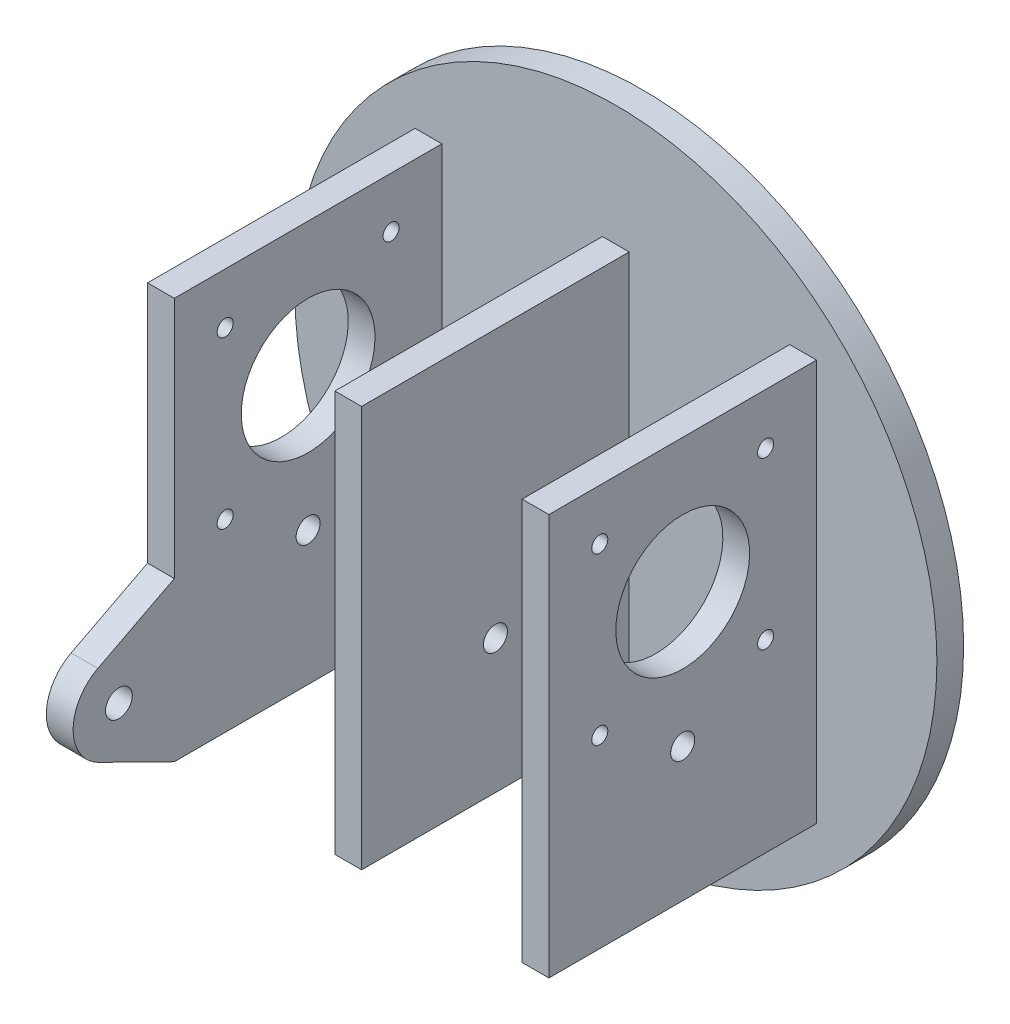
ISO-10303-21;
HEADER;
FILE_DESCRIPTION(('STEP AP214'),'2;1');
FILE_NAME('part.step','',(''),(''),'','','');
FILE_SCHEMA(('AUTOMOTIVE_DESIGN { 1 0 10303 214 1 1 1 1 }'));
ENDSEC;
DATA;
#1=APPLICATION_CONTEXT('core data for automotive mechanical design processes');
#2=APPLICATION_PROTOCOL_DEFINITION('international standard','automotive_design',2000,#1);
#3=PRODUCT_CONTEXT('',#1,'mechanical');
#4=PRODUCT('Part','Part','',(#3));
#5=PRODUCT_RELATED_PRODUCT_CATEGORY('part','',(#4));
#6=PRODUCT_DEFINITION_FORMATION('','',#4);
#7=PRODUCT_DEFINITION_CONTEXT('part definition',#1,'design');
#8=PRODUCT_DEFINITION('design','',#6,#7);
#9=PRODUCT_DEFINITION_SHAPE('','',#8);
#10=(LENGTH_UNIT() NAMED_UNIT(*) SI_UNIT(.MILLI.,.METRE.));
#11=(NAMED_UNIT(*) PLANE_ANGLE_UNIT() SI_UNIT($,.RADIAN.));
#12=(NAMED_UNIT(*) SI_UNIT($,.STERADIAN.) SOLID_ANGLE_UNIT());
#13=UNCERTAINTY_MEASURE_WITH_UNIT(LENGTH_MEASURE(1.E-05),#10,'distance_accuracy_value','');
#14=(GEOMETRIC_REPRESENTATION_CONTEXT(3) GLOBAL_UNCERTAINTY_ASSIGNED_CONTEXT((#13)) GLOBAL_UNIT_ASSIGNED_CONTEXT((#10,
#11,#12)) REPRESENTATION_CONTEXT('',''));
#15=CARTESIAN_POINT('',(0.,0.,0.));
#16=DIRECTION('',(0.,0.,1.));
#17=DIRECTION('',(1.,0.,0.));
#18=AXIS2_PLACEMENT_3D('',#15,#16,#17);
#19=CARTESIAN_POINT('',(0.,-9.96355775662041E-12,55.0000000015785));
#20=DIRECTION('',(0.,5.51836354389934E-13,-1.));
#21=DIRECTION('',(1.,0.,0.));
#22=AXIS2_PLACEMENT_3D('',#19,#20,#21);
#23=PLANE('',#22);
#24=DIRECTION('',(-1.,0.,0.));
#25=VECTOR('',#24,1.);
#26=CARTESIAN_POINT('',(-32.5,-7.85533905933753,55.0000000015741));
#27=LINE('',#26,#25);
#28=CARTESIAN_POINT('',(-32.5,-7.85533905933753,55.0000000015741));
#29=VERTEX_POINT('',#28);
#30=CARTESIAN_POINT('',(-37.5,-7.85533905933753,55.0000000015741));
#31=VERTEX_POINT('',#30);
#32=EDGE_CURVE('E59',#29,#31,#27,.T.);
#33=ORIENTED_EDGE('',*,*,#32,.F.);
#34=DIRECTION('',(0.,1.,5.51836354389934E-13));
#35=VECTOR('',#34,1.);
#36=CARTESIAN_POINT('',(-32.5,-37.5000000000099,55.0000000015578));
#37=LINE('',#36,#35);
#38=CARTESIAN_POINT('',(-32.5,37.4999999999901,55.0000000015992));
#39=VERTEX_POINT('',#38);
#40=EDGE_CURVE('E173',#29,#39,#37,.T.);
#41=ORIENTED_EDGE('',*,*,#40,.T.);
#42=DIRECTION('',(-1.,0.,0.));
#43=VECTOR('',#42,1.);
#44=CARTESIAN_POINT('',(-37.5,37.4999999999901,55.0000000015992));
#45=LINE('',#44,#43);
#46=CARTESIAN_POINT('',(-37.5,37.4999999999901,55.0000000015992));
#47=VERTEX_POINT('',#46);
#48=EDGE_CURVE('E380',#39,#47,#45,.T.);
#49=ORIENTED_EDGE('',*,*,#48,.T.);
#50=DIRECTION('',(0.,-1.,-5.51836354389934E-13));
#51=VECTOR('',#50,1.);
#52=CARTESIAN_POINT('',(-37.5,-37.5000000000099,55.0000000015578));
#53=LINE('',#52,#51);
#54=EDGE_CURVE('E370',#47,#31,#53,.T.);
#55=ORIENTED_EDGE('',*,*,#54,.T.);
#56=EDGE_LOOP('',(#33,#41,#49,#55));
#57=FACE_BOUND('',#56,.T.);
#58=ADVANCED_FACE('F41',(#57),#23,.F.);
#59=CARTESIAN_POINT('',(0.,1.76282599628763E-11,5.00000000157842));
#60=DIRECTION('',(0.,5.51836354389934E-13,-1.));
#61=DIRECTION('',(1.,0.,0.));
#62=AXIS2_PLACEMENT_3D('',#59,#60,#61);
#63=PLANE('',#62);
#64=DIRECTION('',(-1.,0.,0.));
#65=VECTOR('',#64,1.);
#66=CARTESIAN_POINT('',(37.5,37.5000000000176,5.00000000159911));
#67=LINE('',#66,#65);
#68=CARTESIAN_POINT('',(37.5,37.5000000000176,5.00000000159911));
#69=VERTEX_POINT('',#68);
#70=CARTESIAN_POINT('',(32.5,37.5000000000176,5.00000000159911));
#71=VERTEX_POINT('',#70);
#72=EDGE_CURVE('E324',#69,#71,#67,.T.);
#73=ORIENTED_EDGE('',*,*,#72,.F.);
#74=DIRECTION('',(0.,1.,5.51836354389934E-13));
#75=VECTOR('',#74,1.);
#76=CARTESIAN_POINT('',(37.5,-37.4999999999824,5.00000000155773));
#77=LINE('',#76,#75);
#78=CARTESIAN_POINT('',(37.5,-37.4999999999824,5.00000000155773));
#79=VERTEX_POINT('',#78);
#80=EDGE_CURVE('E330',#79,#69,#77,.T.);
#81=ORIENTED_EDGE('',*,*,#80,.F.);
#82=DIRECTION('',(1.,0.,0.));
#83=VECTOR('',#82,1.);
#84=CARTESIAN_POINT('',(37.5,-37.4999999999824,5.00000000155773));
#85=LINE('',#84,#83);
#86=CARTESIAN_POINT('',(32.5,-37.4999999999824,5.00000000155773));
#87=VERTEX_POINT('',#86);
#88=EDGE_CURVE('E347',#87,#79,#85,.T.);
#89=ORIENTED_EDGE('',*,*,#88,.F.);
#90=DIRECTION('',(0.,-1.,-5.51836354389934E-13));
#91=VECTOR('',#90,1.);
#92=CARTESIAN_POINT('',(32.5,-37.4999999999824,5.00000000155773));
#93=LINE('',#92,#91);
#94=EDGE_CURVE('E343',#71,#87,#93,.T.);
#95=ORIENTED_EDGE('',*,*,#94,.F.);
#96=EDGE_LOOP('',(#73,#81,#89,#95));
#97=FACE_BOUND('',#96,.T.);
#98=CARTESIAN_POINT('',(0.,1.76282599628763E-11,5.00000000157842));
#99=DIRECTION('',(0.,5.51836354389934E-13,-1.));
#100=DIRECTION('',(1.,0.,0.));
#101=AXIS2_PLACEMENT_3D('',#98,#99,#100);
#102=CIRCLE('',#101,60.);
#103=CARTESIAN_POINT('',(60.,1.76282599628763E-11,5.00000000157842));
#104=VERTEX_POINT('',#103);
#105=EDGE_CURVE('E51',#104,#104,#102,.T.);
#106=ORIENTED_EDGE('',*,*,#105,.F.);
#107=EDGE_LOOP('',(#106));
#108=FACE_BOUND('',#107,.T.);
#109=DIRECTION('',(0.,-1.,-5.51836354389934E-13));
#110=VECTOR('',#109,1.);
#111=CARTESIAN_POINT('',(-37.5,-37.4999999999823,5.00000000155773));
#112=LINE('',#111,#110);
#113=CARTESIAN_POINT('',(-37.5,37.5000000000177,5.00000000159911));
#114=VERTEX_POINT('',#113);
#115=CARTESIAN_POINT('',(-37.5,-37.4999999999823,5.00000000155773));
#116=VERTEX_POINT('',#115);
#117=EDGE_CURVE('E369',#114,#116,#112,.T.);
#118=ORIENTED_EDGE('',*,*,#117,.F.);
#119=DIRECTION('',(-1.,0.,0.));
#120=VECTOR('',#119,1.);
#121=CARTESIAN_POINT('',(-37.5,37.5000000000177,5.00000000159911));
#122=LINE('',#121,#120);
#123=CARTESIAN_POINT('',(-32.5,37.5000000000177,5.00000000159911));
#124=VERTEX_POINT('',#123);
#125=EDGE_CURVE('E374',#124,#114,#122,.T.);
#126=ORIENTED_EDGE('',*,*,#125,.F.);
#127=DIRECTION('',(0.,1.,5.51836354389934E-13));
#128=VECTOR('',#127,1.);
#129=CARTESIAN_POINT('',(-32.5,-37.4999999999823,5.00000000155773));
#130=LINE('',#129,#128);
#131=CARTESIAN_POINT('',(-32.5,-37.4999999999823,5.00000000155773));
#132=VERTEX_POINT('',#131);
#133=EDGE_CURVE('E391',#132,#124,#130,.T.);
#134=ORIENTED_EDGE('',*,*,#133,.F.);
#135=DIRECTION('',(1.,0.,0.));
#136=VECTOR('',#135,1.);
#137=CARTESIAN_POINT('',(-37.5,-37.4999999999823,5.00000000155773));
#138=LINE('',#137,#136);
#139=EDGE_CURVE('E387',#116,#132,#138,.T.);
#140=ORIENTED_EDGE('',*,*,#139,.F.);
#141=EDGE_LOOP('',(#118,#126,#134,#140));
#142=FACE_BOUND('',#141,.T.);
#143=DIRECTION('',(0.,-1.,-5.51836354389934E-13));
#144=VECTOR('',#143,1.);
#145=CARTESIAN_POINT('',(-2.50000000000001,37.5000000000176,5.00000000159911));
#146=LINE('',#145,#144);
#147=CARTESIAN_POINT('',(-2.50000000000001,37.5000000000176,5.00000000159911));
#148=VERTEX_POINT('',#147);
#149=CARTESIAN_POINT('',(-2.50000000000001,-37.4999999999824,5.00000000155773));
#150=VERTEX_POINT('',#149);
#151=EDGE_CURVE('E296',#148,#150,#146,.T.);
#152=ORIENTED_EDGE('',*,*,#151,.F.);
#153=DIRECTION('',(-1.,0.,0.));
#154=VECTOR('',#153,1.);
#155=CARTESIAN_POINT('',(2.49999999999999,37.5000000000176,5.00000000159911));
#156=LINE('',#155,#154);
#157=CARTESIAN_POINT('',(2.49999999999999,37.5000000000176,5.00000000159911));
#158=VERTEX_POINT('',#157);
#159=EDGE_CURVE('E286',#158,#148,#156,.T.);
#160=ORIENTED_EDGE('',*,*,#159,.F.);
#161=DIRECTION('',(0.,1.,5.51836354389934E-13));
#162=VECTOR('',#161,1.);
#163=CARTESIAN_POINT('',(2.49999999999999,37.5000000000176,5.00000000159911));
#164=LINE('',#163,#162);
#165=CARTESIAN_POINT('',(2.49999999999999,-37.4999999999824,5.00000000155773));
#166=VERTEX_POINT('',#165);
#167=EDGE_CURVE('E303',#166,#158,#164,.T.);
#168=ORIENTED_EDGE('',*,*,#167,.F.);
#169=DIRECTION('',(1.,0.,0.));
#170=VECTOR('',#169,1.);
#171=CARTESIAN_POINT('',(2.49999999999999,-37.4999999999824,5.00000000155773));
#172=LINE('',#171,#170);
#173=EDGE_CURVE('E67',#150,#166,#172,.T.);
#174=ORIENTED_EDGE('',*,*,#173,.F.);
#175=EDGE_LOOP('',(#152,#160,#168,#174));
#176=FACE_BOUND('',#175,.T.);
#177=ADVANCED_FACE('F463',(#97,#108,#142,#176),#63,.F.);
#178=CARTESIAN_POINT('',(0.,2.0387441734826E-11,1.57841795189739E-09));
#179=DIRECTION('',(0.,5.51836354389934E-13,-1.));
#180=DIRECTION('',(1.,0.,0.));
#181=AXIS2_PLACEMENT_3D('',#178,#179,#180);
#182=PLANE('',#181);
#183=CARTESIAN_POINT('',(0.,2.0387441734826E-11,1.57841795189739E-09));
#184=DIRECTION('',(0.,5.51836354389934E-13,-1.));
#185=DIRECTION('',(1.,0.,0.));
#186=AXIS2_PLACEMENT_3D('',#183,#184,#185);
#187=CIRCLE('',#186,60.);
#188=CARTESIAN_POINT('',(60.,2.0387441734826E-11,1.57841795189739E-09));
#189=VERTEX_POINT('',#188);
#190=EDGE_CURVE('E11',#189,#189,#187,.T.);
#191=ORIENTED_EDGE('',*,*,#190,.T.);
#192=EDGE_LOOP('',(#191));
#193=FACE_BOUND('',#192,.T.);
#194=CARTESIAN_POINT('',(0.,2.0387441734826E-11,1.57841795189739E-09));
#195=DIRECTION('',(0.,5.51836354389934E-13,-1.));
#196=DIRECTION('',(1.,0.,0.));
#197=AXIS2_PLACEMENT_3D('',#194,#195,#196);
#198=CIRCLE('',#197,1.5);
#199=CARTESIAN_POINT('',(1.5,2.0387441734826E-11,1.57841795189739E-09));
#200=VERTEX_POINT('',#199);
#201=EDGE_CURVE('E413',#200,#200,#198,.T.);
#202=ORIENTED_EDGE('',*,*,#201,.F.);
#203=EDGE_LOOP('',(#202));
#204=FACE_BOUND('',#203,.T.);
#205=ADVANCED_FACE('F468',(#193,#204),#182,.T.);
#206=CARTESIAN_POINT('',(0.,2.0387441734826E-11,1.57841795189739E-09));
#207=DIRECTION('',(0.,-5.51836354389934E-13,1.));
#208=DIRECTION('',(-1.,0.,0.));
#209=AXIS2_PLACEMENT_3D('',#206,#207,#208);
#210=CYLINDRICAL_SURFACE('',#209,60.);
#211=ORIENTED_EDGE('',*,*,#190,.F.);
#212=EDGE_LOOP('',(#211));
#213=FACE_BOUND('',#212,.T.);
#214=ORIENTED_EDGE('',*,*,#105,.T.);
#215=EDGE_LOOP('',(#214));
#216=FACE_BOUND('',#215,.T.);
#217=ADVANCED_FACE('F43',(#213,#216),#210,.T.);
#218=CARTESIAN_POINT('',(0.,2.0387441734826E-11,1.57841795189739E-09));
#219=DIRECTION('',(0.,-5.51836354389934E-13,1.));
#220=DIRECTION('',(-1.,0.,0.));
#221=AXIS2_PLACEMENT_3D('',#218,#219,#220);
#222=CYLINDRICAL_SURFACE('',#221,1.5);
#223=ORIENTED_EDGE('',*,*,#201,.T.);
#224=EDGE_LOOP('',(#223));
#225=FACE_BOUND('',#224,.T.);
#226=CARTESIAN_POINT('',(0.,1.76282599628763E-11,5.00000000157842));
#227=DIRECTION('',(0.,5.51836354389934E-13,-1.));
#228=DIRECTION('',(1.,0.,0.));
#229=AXIS2_PLACEMENT_3D('',#226,#227,#228);
#230=CIRCLE('',#229,1.5);
#231=CARTESIAN_POINT('',(1.5,1.76282599628763E-11,5.00000000157842));
#232=VERTEX_POINT('',#231);
#233=EDGE_CURVE('E412',#232,#232,#230,.T.);
#234=ORIENTED_EDGE('',*,*,#233,.F.);
#235=EDGE_LOOP('',(#234));
#236=FACE_BOUND('',#235,.T.);
#237=ADVANCED_FACE('F488',(#225,#236),#222,.F.);
#238=CARTESIAN_POINT('',(-37.5,-37.5000000000099,55.0000000015578));
#239=DIRECTION('',(1.,0.,0.));
#240=DIRECTION('',(0.,-1.,-5.51836354389934E-13));
#241=AXIS2_PLACEMENT_3D('',#238,#239,#240);
#242=PLANE('',#241);
#243=CARTESIAN_POINT('',(-37.5,-3.00000000000472,45.5000000015768));
#244=DIRECTION('',(-1.,0.,0.));
#245=DIRECTION('',(0.,1.,5.51836354389934E-13));
#246=AXIS2_PLACEMENT_3D('',#243,#244,#245);
#247=CIRCLE('',#246,1.5);
#248=CARTESIAN_POINT('',(-37.5,-1.50000000000473,45.5000000015776));
#249=VERTEX_POINT('',#248);
#250=EDGE_CURVE('E217',#249,#249,#247,.T.);
#251=ORIENTED_EDGE('',*,*,#250,.F.);
#252=EDGE_LOOP('',(#251));
#253=FACE_BOUND('',#252,.T.);
#254=CARTESIAN_POINT('',(-37.5,28.0000000000124,14.5000000015939));
#255=DIRECTION('',(-1.,0.,0.));
#256=DIRECTION('',(0.,1.,5.51836354389934E-13));
#257=AXIS2_PLACEMENT_3D('',#254,#255,#256);
#258=CIRCLE('',#257,1.50000000000009);
#259=CARTESIAN_POINT('',(-37.5,29.5000000000125,14.5000000015947));
#260=VERTEX_POINT('',#259);
#261=EDGE_CURVE('E210',#260,#260,#258,.T.);
#262=ORIENTED_EDGE('',*,*,#261,.F.);
#263=EDGE_LOOP('',(#262));
#264=FACE_BOUND('',#263,.T.);
#265=CARTESIAN_POINT('',(-37.5,27.9999999999953,45.5000000015939));
#266=DIRECTION('',(-1.,0.,0.));
#267=DIRECTION('',(0.,1.,5.51836354389934E-13));
#268=AXIS2_PLACEMENT_3D('',#265,#266,#267);
#269=CIRCLE('',#268,1.50000000000008);
#270=CARTESIAN_POINT('',(-37.5,29.4999999999954,45.5000000015947));
#271=VERTEX_POINT('',#270);
#272=EDGE_CURVE('E201',#271,#271,#269,.T.);
#273=ORIENTED_EDGE('',*,*,#272,.F.);
#274=EDGE_LOOP('',(#273));
#275=FACE_BOUND('',#274,.T.);
#276=CARTESIAN_POINT('',(-37.5,12.5000000000038,30.0000000015853));
#277=DIRECTION('',(-1.,0.,0.));
#278=DIRECTION('',(0.,1.,5.51836354389934E-13));
#279=AXIS2_PLACEMENT_3D('',#276,#277,#278);
#280=CIRCLE('',#279,12.5);
#281=CARTESIAN_POINT('',(-37.5,25.0000000000038,30.0000000015922));
#282=VERTEX_POINT('',#281);
#283=EDGE_CURVE('E198',#282,#282,#280,.T.);
#284=ORIENTED_EDGE('',*,*,#283,.F.);
#285=EDGE_LOOP('',(#284));
#286=FACE_BOUND('',#285,.T.);
#287=CARTESIAN_POINT('',(-37.5,-2.99999999998762,14.5000000015768));
#288=DIRECTION('',(-1.,0.,0.));
#289=DIRECTION('',(0.,1.,5.51836354389934E-13));
#290=AXIS2_PLACEMENT_3D('',#287,#288,#289);
#291=CIRCLE('',#290,1.5);
#292=CARTESIAN_POINT('',(-37.5,-1.49999999998762,14.5000000015776));
#293=VERTEX_POINT('',#292);
#294=EDGE_CURVE('E226',#293,#293,#291,.T.);
#295=ORIENTED_EDGE('',*,*,#294,.F.);
#296=EDGE_LOOP('',(#295));
#297=FACE_BOUND('',#296,.T.);
#298=CARTESIAN_POINT('',(-37.5,-12.4999999999962,30.0000000015715));
#299=DIRECTION('',(1.,0.,0.));
#300=DIRECTION('',(0.,-1.,-5.51836354389934E-13));
#301=AXIS2_PLACEMENT_3D('',#298,#299,#300);
#302=CIRCLE('',#301,2.24506403026729);
#303=CARTESIAN_POINT('',(-37.5,-14.7450640302635,30.0000000015703));
#304=VERTEX_POINT('',#303);
#305=EDGE_CURVE('E256',#304,#304,#302,.F.);
#306=ORIENTED_EDGE('',*,*,#305,.F.);
#307=EDGE_LOOP('',(#306));
#308=FACE_BOUND('',#307,.T.);
#309=ORIENTED_EDGE('',*,*,#117,.T.);
#310=DIRECTION('',(0.,5.51836354389934E-13,-1.));
#311=VECTOR('',#310,1.);
#312=CARTESIAN_POINT('',(-37.5,-37.5000000000099,55.0000000015578));
#313=LINE('',#312,#311);
#314=CARTESIAN_POINT('',(-37.5,-37.5000000000099,55.0000000015578));
#315=VERTEX_POINT('',#314);
#316=EDGE_CURVE('E408',#315,#116,#313,.T.);
#317=ORIENTED_EDGE('',*,*,#316,.F.);
#318=DIRECTION('',(0.,0.441927974013127,0.897050536917878));
#319=VECTOR('',#318,1.);
#320=CARTESIAN_POINT('',(-37.5,-37.5000000000099,55.0000000015578));
#321=LINE('',#320,#319);
#322=CARTESIAN_POINT('',(-37.5,-30.5347078834141,69.1385461004669));
#323=VERTEX_POINT('',#322);
#324=EDGE_CURVE('E179',#315,#323,#321,.T.);
#325=ORIENTED_EDGE('',*,*,#324,.T.);
#326=CARTESIAN_POINT('',(-37.5,-22.8553390593432,65.355339060893));
#327=DIRECTION('',(-1.,0.,0.));
#328=DIRECTION('',(0.,-1.,-5.51836354389934E-13));
#329=AXIS2_PLACEMENT_3D('',#326,#327,#328);
#330=CIRCLE('',#329,8.5606869490943);
#331=CARTESIAN_POINT('',(-37.5,-15.2528322543766,69.2907235809659));
#332=VERTEX_POINT('',#331);
#333=EDGE_CURVE('E190',#323,#332,#330,.T.);
#334=ORIENTED_EDGE('',*,*,#333,.T.);
#335=DIRECTION('',(0.,0.459704290493794,-0.88807204961174));
#336=VECTOR('',#335,1.);
#337=CARTESIAN_POINT('',(-37.5,-15.2528322543766,69.2907235809659));
#338=LINE('',#337,#336);
#339=EDGE_CURVE('E156',#332,#31,#338,.T.);
#340=ORIENTED_EDGE('',*,*,#339,.T.);
#341=ORIENTED_EDGE('',*,*,#54,.F.);
#342=DIRECTION('',(0.,5.51836354389934E-13,-1.));
#343=VECTOR('',#342,1.);
#344=CARTESIAN_POINT('',(-37.5,37.4999999999901,55.0000000015992));
#345=LINE('',#344,#343);
#346=EDGE_CURVE('E383',#47,#114,#345,.T.);
#347=ORIENTED_EDGE('',*,*,#346,.T.);
#348=EDGE_LOOP('',(#309,#317,#325,#334,#340,#341,#347));
#349=FACE_BOUND('',#348,.T.);
#350=CARTESIAN_POINT('',(-37.5,-22.8553390593432,65.355339060893));
#351=DIRECTION('',(-1.,0.,0.));
#352=DIRECTION('',(0.,1.,5.51836354389934E-13));
#353=AXIS2_PLACEMENT_3D('',#350,#351,#352);
#354=CIRCLE('',#353,2.5);
#355=CARTESIAN_POINT('',(-37.5,-20.3553390593432,65.3553390608944));
#356=VERTEX_POINT('',#355);
#357=EDGE_CURVE('E185',#356,#356,#354,.T.);
#358=ORIENTED_EDGE('',*,*,#357,.F.);
#359=EDGE_LOOP('',(#358));
#360=FACE_BOUND('',#359,.T.);
#361=ADVANCED_FACE('F484',(#253,#264,#275,#286,#297,#308,#349,#360),#242,.F.);
#362=CARTESIAN_POINT('',(-37.5,-37.5000000000099,55.0000000015578));
#363=DIRECTION('',(0.,1.,5.51836354389934E-13));
#364=DIRECTION('',(0.,-5.51836354389934E-13,1.));
#365=AXIS2_PLACEMENT_3D('',#362,#363,#364);
#366=PLANE('',#365);
#367=ORIENTED_EDGE('',*,*,#139,.T.);
#368=DIRECTION('',(0.,5.51836354389934E-13,-1.));
#369=VECTOR('',#368,1.);
#370=CARTESIAN_POINT('',(-32.5,-37.5000000000099,55.0000000015578));
#371=LINE('',#370,#369);
#372=CARTESIAN_POINT('',(-32.5,-37.5000000000099,55.0000000015578));
#373=VERTEX_POINT('',#372);
#374=EDGE_CURVE('E404',#373,#132,#371,.T.);
#375=ORIENTED_EDGE('',*,*,#374,.F.);
#376=DIRECTION('',(1.,0.,0.));
#377=VECTOR('',#376,1.);
#378=CARTESIAN_POINT('',(-37.5,-37.5000000000099,55.0000000015578));
#379=LINE('',#378,#377);
#380=EDGE_CURVE('E373',#315,#373,#379,.T.);
#381=ORIENTED_EDGE('',*,*,#380,.F.);
#382=ORIENTED_EDGE('',*,*,#316,.T.);
#383=EDGE_LOOP('',(#367,#375,#381,#382));
#384=FACE_BOUND('',#383,.T.);
#385=ADVANCED_FACE('F480',(#384),#366,.F.);
#386=CARTESIAN_POINT('',(-32.5,-37.5000000000099,55.0000000015578));
#387=DIRECTION('',(-1.,0.,0.));
#388=DIRECTION('',(0.,1.,5.51836354389934E-13));
#389=AXIS2_PLACEMENT_3D('',#386,#387,#388);
#390=PLANE('',#389);
#391=CARTESIAN_POINT('',(-32.5,-3.00000000000473,45.5000000015768));
#392=DIRECTION('',(-1.,0.,0.));
#393=DIRECTION('',(0.,1.,5.51836354389934E-13));
#394=AXIS2_PLACEMENT_3D('',#391,#392,#393);
#395=CIRCLE('',#394,1.5);
#396=CARTESIAN_POINT('',(-32.5,-1.50000000000473,45.5000000015776));
#397=VERTEX_POINT('',#396);
#398=EDGE_CURVE('E221',#397,#397,#395,.F.);
#399=ORIENTED_EDGE('',*,*,#398,.F.);
#400=EDGE_LOOP('',(#399));
#401=FACE_BOUND('',#400,.T.);
#402=CARTESIAN_POINT('',(-32.5,28.0000000000124,14.5000000015939));
#403=DIRECTION('',(-1.,0.,0.));
#404=DIRECTION('',(0.,1.,5.51836354389934E-13));
#405=AXIS2_PLACEMENT_3D('',#402,#403,#404);
#406=CIRCLE('',#405,1.50000000000009);
#407=CARTESIAN_POINT('',(-32.5,29.5000000000125,14.5000000015947));
#408=VERTEX_POINT('',#407);
#409=EDGE_CURVE('E222',#408,#408,#406,.F.);
#410=ORIENTED_EDGE('',*,*,#409,.F.);
#411=EDGE_LOOP('',(#410));
#412=FACE_BOUND('',#411,.T.);
#413=CARTESIAN_POINT('',(-32.5,27.9999999999953,45.5000000015939));
#414=DIRECTION('',(-1.,0.,0.));
#415=DIRECTION('',(0.,1.,5.51836354389934E-13));
#416=AXIS2_PLACEMENT_3D('',#413,#414,#415);
#417=CIRCLE('',#416,1.50000000000008);
#418=CARTESIAN_POINT('',(-32.5,29.4999999999954,45.5000000015947));
#419=VERTEX_POINT('',#418);
#420=EDGE_CURVE('E205',#419,#419,#417,.F.);
#421=ORIENTED_EDGE('',*,*,#420,.F.);
#422=EDGE_LOOP('',(#421));
#423=FACE_BOUND('',#422,.T.);
#424=CARTESIAN_POINT('',(-32.5,12.5000000000038,30.0000000015853));
#425=DIRECTION('',(-1.,0.,0.));
#426=DIRECTION('',(0.,1.,5.51836354389934E-13));
#427=AXIS2_PLACEMENT_3D('',#424,#425,#426);
#428=CIRCLE('',#427,12.5);
#429=CARTESIAN_POINT('',(-32.5,25.0000000000038,30.0000000015922));
#430=VERTEX_POINT('',#429);
#431=EDGE_CURVE('E206',#430,#430,#428,.F.);
#432=ORIENTED_EDGE('',*,*,#431,.F.);
#433=EDGE_LOOP('',(#432));
#434=FACE_BOUND('',#433,.T.);
#435=CARTESIAN_POINT('',(-32.5,-2.99999999998762,14.5000000015768));
#436=DIRECTION('',(-1.,0.,0.));
#437=DIRECTION('',(0.,1.,5.51836354389934E-13));
#438=AXIS2_PLACEMENT_3D('',#435,#436,#437);
#439=CIRCLE('',#438,1.5);
#440=CARTESIAN_POINT('',(-32.5,-1.49999999998762,14.5000000015776));
#441=VERTEX_POINT('',#440);
#442=EDGE_CURVE('E236',#441,#441,#439,.F.);
#443=ORIENTED_EDGE('',*,*,#442,.F.);
#444=EDGE_LOOP('',(#443));
#445=FACE_BOUND('',#444,.T.);
#446=CARTESIAN_POINT('',(-32.5,-12.4999999999962,30.0000000015715));
#447=DIRECTION('',(-1.,0.,0.));
#448=DIRECTION('',(0.,1.,5.51836354389934E-13));
#449=AXIS2_PLACEMENT_3D('',#446,#447,#448);
#450=CIRCLE('',#449,2.24506403026729);
#451=CARTESIAN_POINT('',(-32.5,-10.2549359697289,30.0000000015728));
#452=VERTEX_POINT('',#451);
#453=EDGE_CURVE('E252',#452,#452,#450,.F.);
#454=ORIENTED_EDGE('',*,*,#453,.F.);
#455=EDGE_LOOP('',(#454));
#456=FACE_BOUND('',#455,.T.);
#457=ORIENTED_EDGE('',*,*,#133,.T.);
#458=DIRECTION('',(0.,5.51836354389934E-13,-1.));
#459=VECTOR('',#458,1.);
#460=CARTESIAN_POINT('',(-32.5,37.4999999999901,55.0000000015992));
#461=LINE('',#460,#459);
#462=EDGE_CURVE('E400',#39,#124,#461,.T.);
#463=ORIENTED_EDGE('',*,*,#462,.F.);
#464=ORIENTED_EDGE('',*,*,#40,.F.);
#465=DIRECTION('',(0.,0.459704290493794,-0.88807204961174));
#466=VECTOR('',#465,1.);
#467=CARTESIAN_POINT('',(-32.5,-15.2528322543766,69.2907235809659));
#468=LINE('',#467,#466);
#469=CARTESIAN_POINT('',(-32.5,-15.2528322543766,69.2907235809659));
#470=VERTEX_POINT('',#469);
#471=EDGE_CURVE('E154',#470,#29,#468,.T.);
#472=ORIENTED_EDGE('',*,*,#471,.F.);
#473=CARTESIAN_POINT('',(-32.5,-22.8553390593432,65.355339060893));
#474=DIRECTION('',(-1.,0.,0.));
#475=DIRECTION('',(0.,-1.,-5.51836354389934E-13));
#476=AXIS2_PLACEMENT_3D('',#473,#474,#475);
#477=CIRCLE('',#476,8.5606869490943);
#478=CARTESIAN_POINT('',(-32.5,-30.5347078834141,69.1385461004669));
#479=VERTEX_POINT('',#478);
#480=EDGE_CURVE('E170',#479,#470,#477,.T.);
#481=ORIENTED_EDGE('',*,*,#480,.F.);
#482=DIRECTION('',(0.,0.441927974013127,0.897050536917878));
#483=VECTOR('',#482,1.);
#484=CARTESIAN_POINT('',(-32.5,-37.5000000000099,55.0000000015578));
#485=LINE('',#484,#483);
#486=EDGE_CURVE('E162',#373,#479,#485,.T.);
#487=ORIENTED_EDGE('',*,*,#486,.F.);
#488=ORIENTED_EDGE('',*,*,#374,.T.);
#489=EDGE_LOOP('',(#457,#463,#464,#472,#481,#487,#488));
#490=FACE_BOUND('',#489,.T.);
#491=CARTESIAN_POINT('',(-32.5,-22.8553390593432,65.355339060893));
#492=DIRECTION('',(-1.,0.,0.));
#493=DIRECTION('',(0.,1.,5.51836354389934E-13));
#494=AXIS2_PLACEMENT_3D('',#491,#492,#493);
#495=CIRCLE('',#494,2.5);
#496=CARTESIAN_POINT('',(-32.5,-20.3553390593432,65.3553390608944));
#497=VERTEX_POINT('',#496);
#498=EDGE_CURVE('E193',#497,#497,#495,.T.);
#499=ORIENTED_EDGE('',*,*,#498,.T.);
#500=EDGE_LOOP('',(#499));
#501=FACE_BOUND('',#500,.T.);
#502=ADVANCED_FACE('F167',(#401,#412,#423,#434,#445,#456,#490,#501),#390,.F.);
#503=CARTESIAN_POINT('',(-37.5,37.4999999999901,55.0000000015992));
#504=DIRECTION('',(0.,-1.,-5.51836354389934E-13));
#505=DIRECTION('',(0.,5.51836354389934E-13,-1.));
#506=AXIS2_PLACEMENT_3D('',#503,#504,#505);
#507=PLANE('',#506);
#508=ORIENTED_EDGE('',*,*,#125,.T.);
#509=ORIENTED_EDGE('',*,*,#346,.F.);
#510=ORIENTED_EDGE('',*,*,#48,.F.);
#511=ORIENTED_EDGE('',*,*,#462,.T.);
#512=EDGE_LOOP('',(#508,#509,#510,#511));
#513=FACE_BOUND('',#512,.T.);
#514=ADVANCED_FACE('F474',(#513),#507,.F.);
#515=CARTESIAN_POINT('',(37.5,37.49999999999,55.0000000015992));
#516=DIRECTION('',(0.,-1.,-5.51836354389934E-13));
#517=DIRECTION('',(0.,5.51836354389934E-13,-1.));
#518=AXIS2_PLACEMENT_3D('',#515,#516,#517);
#519=PLANE('',#518);
#520=ORIENTED_EDGE('',*,*,#72,.T.);
#521=DIRECTION('',(0.,5.51836354389934E-13,-1.));
#522=VECTOR('',#521,1.);
#523=CARTESIAN_POINT('',(32.5,37.49999999999,55.0000000015992));
#524=LINE('',#523,#522);
#525=CARTESIAN_POINT('',(32.5,37.49999999999,55.0000000015992));
#526=VERTEX_POINT('',#525);
#527=EDGE_CURVE('E365',#526,#71,#524,.T.);
#528=ORIENTED_EDGE('',*,*,#527,.F.);
#529=DIRECTION('',(-1.,0.,0.));
#530=VECTOR('',#529,1.);
#531=CARTESIAN_POINT('',(37.5,37.49999999999,55.0000000015992));
#532=LINE('',#531,#530);
#533=CARTESIAN_POINT('',(37.5,37.49999999999,55.0000000015992));
#534=VERTEX_POINT('',#533);
#535=EDGE_CURVE('E325',#534,#526,#532,.T.);
#536=ORIENTED_EDGE('',*,*,#535,.F.);
#537=DIRECTION('',(0.,5.51836354389934E-13,-1.));
#538=VECTOR('',#537,1.);
#539=CARTESIAN_POINT('',(37.5,37.49999999999,55.0000000015992));
#540=LINE('',#539,#538);
#541=EDGE_CURVE('E339',#534,#69,#540,.T.);
#542=ORIENTED_EDGE('',*,*,#541,.T.);
#543=EDGE_LOOP('',(#520,#528,#536,#542));
#544=FACE_BOUND('',#543,.T.);
#545=ADVANCED_FACE('F472',(#544),#519,.F.);
#546=CARTESIAN_POINT('',(32.5,-37.50000000001,55.0000000015578));
#547=DIRECTION('',(1.,0.,0.));
#548=DIRECTION('',(0.,-1.,-5.51836354389934E-13));
#549=AXIS2_PLACEMENT_3D('',#546,#547,#548);
#550=PLANE('',#549);
#551=CARTESIAN_POINT('',(32.5,-12.4999999999962,30.0000000015715));
#552=DIRECTION('',(1.,0.,0.));
#553=DIRECTION('',(0.,-1.,-5.51836354389934E-13));
#554=AXIS2_PLACEMENT_3D('',#551,#552,#553);
#555=CIRCLE('',#554,2.24506403026729);
#556=CARTESIAN_POINT('',(32.5,-14.7450640302635,30.0000000015703));
#557=VERTEX_POINT('',#556);
#558=EDGE_CURVE('E248',#557,#557,#555,.F.);
#559=ORIENTED_EDGE('',*,*,#558,.F.);
#560=EDGE_LOOP('',(#559));
#561=FACE_BOUND('',#560,.T.);
#562=CARTESIAN_POINT('',(32.5,-3.00000000000496,45.5000000015768));
#563=DIRECTION('',(-1.,0.,0.));
#564=DIRECTION('',(0.,1.,5.51836354389934E-13));
#565=AXIS2_PLACEMENT_3D('',#562,#563,#564);
#566=CIRCLE('',#565,1.5);
#567=CARTESIAN_POINT('',(32.5,-1.50000000000496,45.5000000015776));
#568=VERTEX_POINT('',#567);
#569=EDGE_CURVE('E269',#568,#568,#566,.T.);
#570=ORIENTED_EDGE('',*,*,#569,.F.);
#571=EDGE_LOOP('',(#570));
#572=FACE_BOUND('',#571,.T.);
#573=CARTESIAN_POINT('',(32.5,28.0000000000121,14.5000000015939));
#574=DIRECTION('',(-1.,0.,0.));
#575=DIRECTION('',(0.,1.,5.51836354389934E-13));
#576=AXIS2_PLACEMENT_3D('',#573,#574,#575);
#577=CIRCLE('',#576,1.50000000000009);
#578=CARTESIAN_POINT('',(32.5,29.5000000000122,14.5000000015948));
#579=VERTEX_POINT('',#578);
#580=EDGE_CURVE('E265',#579,#579,#577,.T.);
#581=ORIENTED_EDGE('',*,*,#580,.F.);
#582=EDGE_LOOP('',(#581));
#583=FACE_BOUND('',#582,.T.);
#584=CARTESIAN_POINT('',(32.5,27.9999999999952,45.5000000015939));
#585=DIRECTION('',(-1.,0.,0.));
#586=DIRECTION('',(0.,1.,5.51836354389934E-13));
#587=AXIS2_PLACEMENT_3D('',#584,#585,#586);
#588=CIRCLE('',#587,1.50000000000009);
#589=CARTESIAN_POINT('',(32.5,29.4999999999953,45.5000000015948));
#590=VERTEX_POINT('',#589);
#591=EDGE_CURVE('E261',#590,#590,#588,.T.);
#592=ORIENTED_EDGE('',*,*,#591,.F.);
#593=EDGE_LOOP('',(#592));
#594=FACE_BOUND('',#593,.T.);
#595=CARTESIAN_POINT('',(32.5,12.5000000000036,30.0000000015853));
#596=DIRECTION('',(-1.,0.,0.));
#597=DIRECTION('',(0.,1.,5.51836354389934E-13));
#598=AXIS2_PLACEMENT_3D('',#595,#596,#597);
#599=CIRCLE('',#598,12.5);
#600=CARTESIAN_POINT('',(32.5,25.0000000000036,30.0000000015922));
#601=VERTEX_POINT('',#600);
#602=EDGE_CURVE('E260',#601,#601,#599,.T.);
#603=ORIENTED_EDGE('',*,*,#602,.F.);
#604=EDGE_LOOP('',(#603));
#605=FACE_BOUND('',#604,.T.);
#606=CARTESIAN_POINT('',(32.5,-2.99999999998786,14.5000000015768));
#607=DIRECTION('',(-1.,0.,0.));
#608=DIRECTION('',(0.,1.,5.51836354389934E-13));
#609=AXIS2_PLACEMENT_3D('',#606,#607,#608);
#610=CIRCLE('',#609,1.5);
#611=CARTESIAN_POINT('',(32.5,-1.49999999998786,14.5000000015776));
#612=VERTEX_POINT('',#611);
#613=EDGE_CURVE('E273',#612,#612,#610,.T.);
#614=ORIENTED_EDGE('',*,*,#613,.F.);
#615=EDGE_LOOP('',(#614));
#616=FACE_BOUND('',#615,.T.);
#617=ORIENTED_EDGE('',*,*,#94,.T.);
#618=DIRECTION('',(0.,5.51836354389934E-13,-1.));
#619=VECTOR('',#618,1.);
#620=CARTESIAN_POINT('',(32.5,-37.50000000001,55.0000000015578));
#621=LINE('',#620,#619);
#622=CARTESIAN_POINT('',(32.5,-37.50000000001,55.0000000015578));
#623=VERTEX_POINT('',#622);
#624=EDGE_CURVE('E361',#623,#87,#621,.T.);
#625=ORIENTED_EDGE('',*,*,#624,.F.);
#626=DIRECTION('',(0.,-1.,-5.51836354389934E-13));
#627=VECTOR('',#626,1.);
#628=CARTESIAN_POINT('',(32.5,-37.50000000001,55.0000000015578));
#629=LINE('',#628,#627);
#630=EDGE_CURVE('E329',#526,#623,#629,.T.);
#631=ORIENTED_EDGE('',*,*,#630,.F.);
#632=ORIENTED_EDGE('',*,*,#527,.T.);
#633=EDGE_LOOP('',(#617,#625,#631,#632));
#634=FACE_BOUND('',#633,.T.);
#635=ADVANCED_FACE('F539',(#561,#572,#583,#594,#605,#616,#634),#550,.F.);
#636=CARTESIAN_POINT('',(37.5,-37.50000000001,55.0000000015578));
#637=DIRECTION('',(0.,1.,5.51836354389934E-13));
#638=DIRECTION('',(0.,-5.51836354389934E-13,1.));
#639=AXIS2_PLACEMENT_3D('',#636,#637,#638);
#640=PLANE('',#639);
#641=ORIENTED_EDGE('',*,*,#88,.T.);
#642=DIRECTION('',(0.,5.51836354389934E-13,-1.));
#643=VECTOR('',#642,1.);
#644=CARTESIAN_POINT('',(37.5,-37.50000000001,55.0000000015578));
#645=LINE('',#644,#643);
#646=CARTESIAN_POINT('',(37.5,-37.50000000001,55.0000000015578));
#647=VERTEX_POINT('',#646);
#648=EDGE_CURVE('E357',#647,#79,#645,.T.);
#649=ORIENTED_EDGE('',*,*,#648,.F.);
#650=DIRECTION('',(1.,0.,0.));
#651=VECTOR('',#650,1.);
#652=CARTESIAN_POINT('',(37.5,-37.50000000001,55.0000000015578));
#653=LINE('',#652,#651);
#654=EDGE_CURVE('E333',#623,#647,#653,.T.);
#655=ORIENTED_EDGE('',*,*,#654,.F.);
#656=ORIENTED_EDGE('',*,*,#624,.T.);
#657=EDGE_LOOP('',(#641,#649,#655,#656));
#658=FACE_BOUND('',#657,.T.);
#659=ADVANCED_FACE('F536',(#658),#640,.F.);
#660=CARTESIAN_POINT('',(37.5,-37.50000000001,55.0000000015578));
#661=DIRECTION('',(-1.,0.,0.));
#662=DIRECTION('',(0.,1.,5.51836354389934E-13));
#663=AXIS2_PLACEMENT_3D('',#660,#661,#662);
#664=PLANE('',#663);
#665=CARTESIAN_POINT('',(37.5,-12.4999999999962,30.0000000015715));
#666=DIRECTION('',(-1.,0.,0.));
#667=DIRECTION('',(0.,1.,5.51836354389934E-13));
#668=AXIS2_PLACEMENT_3D('',#665,#666,#667);
#669=CIRCLE('',#668,2.24506403026729);
#670=CARTESIAN_POINT('',(37.5,-10.2549359697289,30.0000000015728));
#671=VERTEX_POINT('',#670);
#672=EDGE_CURVE('E244',#671,#671,#669,.F.);
#673=ORIENTED_EDGE('',*,*,#672,.F.);
#674=EDGE_LOOP('',(#673));
#675=FACE_BOUND('',#674,.T.);
#676=CARTESIAN_POINT('',(37.5,-3.00000000000496,45.5000000015768));
#677=DIRECTION('',(-1.,0.,0.));
#678=DIRECTION('',(0.,1.,5.51836354389934E-13));
#679=AXIS2_PLACEMENT_3D('',#676,#677,#678);
#680=CIRCLE('',#679,1.5);
#681=CARTESIAN_POINT('',(37.5,-1.50000000000496,45.5000000015776));
#682=VERTEX_POINT('',#681);
#683=EDGE_CURVE('E300',#682,#682,#680,.T.);
#684=ORIENTED_EDGE('',*,*,#683,.T.);
#685=EDGE_LOOP('',(#684));
#686=FACE_BOUND('',#685,.T.);
#687=CARTESIAN_POINT('',(37.5,28.0000000000121,14.5000000015939));
#688=DIRECTION('',(-1.,0.,0.));
#689=DIRECTION('',(0.,1.,5.51836354389934E-13));
#690=AXIS2_PLACEMENT_3D('',#687,#688,#689);
#691=CIRCLE('',#690,1.50000000000009);
#692=CARTESIAN_POINT('',(37.5,29.5000000000122,14.5000000015948));
#693=VERTEX_POINT('',#692);
#694=EDGE_CURVE('E434',#693,#693,#691,.T.);
#695=ORIENTED_EDGE('',*,*,#694,.T.);
#696=EDGE_LOOP('',(#695));
#697=FACE_BOUND('',#696,.T.);
#698=CARTESIAN_POINT('',(37.5,27.9999999999952,45.5000000015939));
#699=DIRECTION('',(-1.,0.,0.));
#700=DIRECTION('',(0.,1.,5.51836354389934E-13));
#701=AXIS2_PLACEMENT_3D('',#698,#699,#700);
#702=CIRCLE('',#701,1.50000000000009);
#703=CARTESIAN_POINT('',(37.5,29.4999999999953,45.5000000015948));
#704=VERTEX_POINT('',#703);
#705=EDGE_CURVE('E430',#704,#704,#702,.T.);
#706=ORIENTED_EDGE('',*,*,#705,.T.);
#707=EDGE_LOOP('',(#706));
#708=FACE_BOUND('',#707,.T.);
#709=CARTESIAN_POINT('',(37.5,12.5000000000036,30.0000000015853));
#710=DIRECTION('',(-1.,0.,0.));
#711=DIRECTION('',(0.,1.,5.51836354389934E-13));
#712=AXIS2_PLACEMENT_3D('',#709,#710,#711);
#713=CIRCLE('',#712,12.5);
#714=CARTESIAN_POINT('',(37.5,25.0000000000036,30.0000000015922));
#715=VERTEX_POINT('',#714);
#716=EDGE_CURVE('E426',#715,#715,#713,.T.);
#717=ORIENTED_EDGE('',*,*,#716,.T.);
#718=EDGE_LOOP('',(#717));
#719=FACE_BOUND('',#718,.T.);
#720=CARTESIAN_POINT('',(37.5,-2.99999999998786,14.5000000015768));
#721=DIRECTION('',(-1.,0.,0.));
#722=DIRECTION('',(0.,1.,5.51836354389934E-13));
#723=AXIS2_PLACEMENT_3D('',#720,#721,#722);
#724=CIRCLE('',#723,1.5);
#725=CARTESIAN_POINT('',(37.5,-1.49999999998786,14.5000000015776));
#726=VERTEX_POINT('',#725);
#727=EDGE_CURVE('E280',#726,#726,#724,.T.);
#728=ORIENTED_EDGE('',*,*,#727,.T.);
#729=EDGE_LOOP('',(#728));
#730=FACE_BOUND('',#729,.T.);
#731=ORIENTED_EDGE('',*,*,#80,.T.);
#732=ORIENTED_EDGE('',*,*,#541,.F.);
#733=DIRECTION('',(0.,1.,5.51836354389934E-13));
#734=VECTOR('',#733,1.);
#735=CARTESIAN_POINT('',(37.5,-37.50000000001,55.0000000015578));
#736=LINE('',#735,#734);
#737=EDGE_CURVE('E336',#647,#534,#736,.T.);
#738=ORIENTED_EDGE('',*,*,#737,.F.);
#739=ORIENTED_EDGE('',*,*,#648,.T.);
#740=EDGE_LOOP('',(#731,#732,#738,#739));
#741=FACE_BOUND('',#740,.T.);
#742=ADVANCED_FACE('F441',(#675,#686,#697,#708,#719,#730,#741),#664,.F.);
#743=CARTESIAN_POINT('',(0.,-9.96355775662041E-12,55.0000000015785));
#744=DIRECTION('',(0.,5.51836354389934E-13,-1.));
#745=DIRECTION('',(1.,0.,0.));
#746=AXIS2_PLACEMENT_3D('',#743,#744,#745);
#747=PLANE('',#746);
#748=ORIENTED_EDGE('',*,*,#535,.T.);
#749=ORIENTED_EDGE('',*,*,#630,.T.);
#750=ORIENTED_EDGE('',*,*,#654,.T.);
#751=ORIENTED_EDGE('',*,*,#737,.T.);
#752=EDGE_LOOP('',(#748,#749,#750,#751));
#753=FACE_BOUND('',#752,.T.);
#754=ADVANCED_FACE('F508',(#753),#747,.F.);
#755=CARTESIAN_POINT('',(0.,1.76282599628763E-11,5.00000000157842));
#756=DIRECTION('',(0.,5.51836354389934E-13,-1.));
#757=DIRECTION('',(1.,0.,0.));
#758=AXIS2_PLACEMENT_3D('',#755,#756,#757);
#759=PLANE('',#758);
#760=ORIENTED_EDGE('',*,*,#233,.T.);
#761=EDGE_LOOP('',(#760));
#762=FACE_BOUND('',#761,.T.);
#763=ADVANCED_FACE('F505',(#762),#759,.T.);
#764=CARTESIAN_POINT('',(-2.50000000000001,37.4999999999901,55.0000000015992));
#765=DIRECTION('',(1.,0.,0.));
#766=DIRECTION('',(0.,-5.51836354389934E-13,1.));
#767=AXIS2_PLACEMENT_3D('',#764,#765,#766);
#768=PLANE('',#767);
#769=CARTESIAN_POINT('',(-2.50000000000001,-12.4999999999962,30.0000000015715));
#770=DIRECTION('',(1.,0.,0.));
#771=DIRECTION('',(0.,-5.51836354389934E-13,1.));
#772=AXIS2_PLACEMENT_3D('',#769,#770,#771);
#773=CIRCLE('',#772,2.24506403026729);
#774=CARTESIAN_POINT('',(-2.50000000000001,-12.4999999999974,32.2450640318388));
#775=VERTEX_POINT('',#774);
#776=EDGE_CURVE('E240',#775,#775,#773,.F.);
#777=ORIENTED_EDGE('',*,*,#776,.F.);
#778=EDGE_LOOP('',(#777));
#779=FACE_BOUND('',#778,.T.);
#780=ORIENTED_EDGE('',*,*,#151,.T.);
#781=DIRECTION('',(0.,5.51836354389934E-13,-1.));
#782=VECTOR('',#781,1.);
#783=CARTESIAN_POINT('',(-2.50000000000001,-37.50000000001,55.0000000015578));
#784=LINE('',#783,#782);
#785=CARTESIAN_POINT('',(-2.50000000000001,-37.50000000001,55.0000000015578));
#786=VERTEX_POINT('',#785);
#787=EDGE_CURVE('E321',#786,#150,#784,.T.);
#788=ORIENTED_EDGE('',*,*,#787,.F.);
#789=DIRECTION('',(0.,-1.,-5.51836354389934E-13));
#790=VECTOR('',#789,1.);
#791=CARTESIAN_POINT('',(-2.50000000000001,37.4999999999901,55.0000000015992));
#792=LINE('',#791,#790);
#793=CARTESIAN_POINT('',(-2.50000000000001,37.4999999999901,55.0000000015992));
#794=VERTEX_POINT('',#793);
#795=EDGE_CURVE('E281',#794,#786,#792,.T.);
#796=ORIENTED_EDGE('',*,*,#795,.F.);
#797=DIRECTION('',(0.,5.51836354389934E-13,-1.));
#798=VECTOR('',#797,1.);
#799=CARTESIAN_POINT('',(-2.50000000000001,37.4999999999901,55.0000000015992));
#800=LINE('',#799,#798);
#801=EDGE_CURVE('E295',#794,#148,#800,.T.);
#802=ORIENTED_EDGE('',*,*,#801,.T.);
#803=EDGE_LOOP('',(#780,#788,#796,#802));
#804=FACE_BOUND('',#803,.T.);
#805=ADVANCED_FACE('F507',(#779,#804),#768,.F.);
#806=CARTESIAN_POINT('',(2.49999999999999,-37.50000000001,55.0000000015578));
#807=DIRECTION('',(0.,1.,5.51836354389934E-13));
#808=DIRECTION('',(1.,0.,0.));
#809=AXIS2_PLACEMENT_3D('',#806,#807,#808);
#810=PLANE('',#809);
#811=ORIENTED_EDGE('',*,*,#173,.T.);
#812=DIRECTION('',(0.,5.51836354389934E-13,-1.));
#813=VECTOR('',#812,1.);
#814=CARTESIAN_POINT('',(2.49999999999999,-37.50000000001,55.0000000015578));
#815=LINE('',#814,#813);
#816=CARTESIAN_POINT('',(2.49999999999999,-37.50000000001,55.0000000015578));
#817=VERTEX_POINT('',#816);
#818=EDGE_CURVE('E317',#817,#166,#815,.T.);
#819=ORIENTED_EDGE('',*,*,#818,.F.);
#820=DIRECTION('',(1.,0.,0.));
#821=VECTOR('',#820,1.);
#822=CARTESIAN_POINT('',(2.49999999999999,-37.50000000001,55.0000000015578));
#823=LINE('',#822,#821);
#824=EDGE_CURVE('E285',#786,#817,#823,.T.);
#825=ORIENTED_EDGE('',*,*,#824,.F.);
#826=ORIENTED_EDGE('',*,*,#787,.T.);
#827=EDGE_LOOP('',(#811,#819,#825,#826));
#828=FACE_BOUND('',#827,.T.);
#829=ADVANCED_FACE('F514',(#828),#810,.F.);
#830=CARTESIAN_POINT('',(2.49999999999999,37.4999999999901,55.0000000015992));
#831=DIRECTION('',(-1.,0.,0.));
#832=DIRECTION('',(0.,5.51836354389934E-13,-1.));
#833=AXIS2_PLACEMENT_3D('',#830,#831,#832);
#834=PLANE('',#833);
#835=CARTESIAN_POINT('',(2.5,-12.4999999999962,30.0000000015715));
#836=DIRECTION('',(-1.,0.,0.));
#837=DIRECTION('',(0.,5.51836354389934E-13,-1.));
#838=AXIS2_PLACEMENT_3D('',#835,#836,#837);
#839=CIRCLE('',#838,2.24506403026729);
#840=CARTESIAN_POINT('',(2.5,-12.4999999999949,27.7549359713043));
#841=VERTEX_POINT('',#840);
#842=EDGE_CURVE('E45',#841,#841,#839,.F.);
#843=ORIENTED_EDGE('',*,*,#842,.F.);
#844=EDGE_LOOP('',(#843));
#845=FACE_BOUND('',#844,.T.);
#846=ORIENTED_EDGE('',*,*,#167,.T.);
#847=DIRECTION('',(0.,5.51836354389934E-13,-1.));
#848=VECTOR('',#847,1.);
#849=CARTESIAN_POINT('',(2.49999999999999,37.4999999999901,55.0000000015992));
#850=LINE('',#849,#848);
#851=CARTESIAN_POINT('',(2.49999999999999,37.4999999999901,55.0000000015992));
#852=VERTEX_POINT('',#851);
#853=EDGE_CURVE('E313',#852,#158,#850,.T.);
#854=ORIENTED_EDGE('',*,*,#853,.F.);
#855=DIRECTION('',(0.,1.,5.51836354389934E-13));
#856=VECTOR('',#855,1.);
#857=CARTESIAN_POINT('',(2.49999999999999,37.4999999999901,55.0000000015992));
#858=LINE('',#857,#856);
#859=EDGE_CURVE('E289',#817,#852,#858,.T.);
#860=ORIENTED_EDGE('',*,*,#859,.F.);
#861=ORIENTED_EDGE('',*,*,#818,.T.);
#862=EDGE_LOOP('',(#846,#854,#860,#861));
#863=FACE_BOUND('',#862,.T.);
#864=ADVANCED_FACE('F526',(#845,#863),#834,.F.);
#865=CARTESIAN_POINT('',(2.49999999999999,37.4999999999901,55.0000000015992));
#866=DIRECTION('',(0.,-1.,-5.51836354389934E-13));
#867=DIRECTION('',(0.,5.51836354389934E-13,-1.));
#868=AXIS2_PLACEMENT_3D('',#865,#866,#867);
#869=PLANE('',#868);
#870=ORIENTED_EDGE('',*,*,#159,.T.);
#871=ORIENTED_EDGE('',*,*,#801,.F.);
#872=DIRECTION('',(-1.,0.,0.));
#873=VECTOR('',#872,1.);
#874=CARTESIAN_POINT('',(2.49999999999999,37.4999999999901,55.0000000015992));
#875=LINE('',#874,#873);
#876=EDGE_CURVE('E292',#852,#794,#875,.T.);
#877=ORIENTED_EDGE('',*,*,#876,.F.);
#878=ORIENTED_EDGE('',*,*,#853,.T.);
#879=EDGE_LOOP('',(#870,#871,#877,#878));
#880=FACE_BOUND('',#879,.T.);
#881=ADVANCED_FACE('F523',(#880),#869,.F.);
#882=CARTESIAN_POINT('',(0.,-9.96355775662041E-12,55.0000000015785));
#883=DIRECTION('',(0.,5.51836354389934E-13,-1.));
#884=DIRECTION('',(1.,0.,0.));
#885=AXIS2_PLACEMENT_3D('',#882,#883,#884);
#886=PLANE('',#885);
#887=ORIENTED_EDGE('',*,*,#795,.T.);
#888=ORIENTED_EDGE('',*,*,#824,.T.);
#889=ORIENTED_EDGE('',*,*,#859,.T.);
#890=ORIENTED_EDGE('',*,*,#876,.T.);
#891=EDGE_LOOP('',(#887,#888,#889,#890));
#892=FACE_BOUND('',#891,.T.);
#893=ADVANCED_FACE('F521',(#892),#886,.F.);
#894=CARTESIAN_POINT('',(60.,-2.99999999998786,14.5000000015768));
#895=DIRECTION('',(-1.,0.,0.));
#896=DIRECTION('',(0.,1.,5.51836354389934E-13));
#897=AXIS2_PLACEMENT_3D('',#894,#895,#896);
#898=CYLINDRICAL_SURFACE('',#897,1.5);
#899=ORIENTED_EDGE('',*,*,#613,.T.);
#900=EDGE_LOOP('',(#899));
#901=FACE_BOUND('',#900,.T.);
#902=ORIENTED_EDGE('',*,*,#727,.F.);
#903=EDGE_LOOP('',(#902));
#904=FACE_BOUND('',#903,.T.);
#905=ADVANCED_FACE('F581',(#901,#904),#898,.F.);
#906=CARTESIAN_POINT('',(60.,12.5000000000036,30.0000000015853));
#907=DIRECTION('',(-1.,0.,0.));
#908=DIRECTION('',(0.,1.,5.51836354389934E-13));
#909=AXIS2_PLACEMENT_3D('',#906,#907,#908);
#910=CYLINDRICAL_SURFACE('',#909,12.5);
#911=ORIENTED_EDGE('',*,*,#602,.T.);
#912=EDGE_LOOP('',(#911));
#913=FACE_BOUND('',#912,.T.);
#914=ORIENTED_EDGE('',*,*,#716,.F.);
#915=EDGE_LOOP('',(#914));
#916=FACE_BOUND('',#915,.T.);
#917=ADVANCED_FACE('F585',(#913,#916),#910,.F.);
#918=CARTESIAN_POINT('',(60.,27.9999999999952,45.5000000015939));
#919=DIRECTION('',(-1.,0.,0.));
#920=DIRECTION('',(0.,1.,5.51836354389934E-13));
#921=AXIS2_PLACEMENT_3D('',#918,#919,#920);
#922=CYLINDRICAL_SURFACE('',#921,1.50000000000009);
#923=ORIENTED_EDGE('',*,*,#591,.T.);
#924=EDGE_LOOP('',(#923));
#925=FACE_BOUND('',#924,.T.);
#926=ORIENTED_EDGE('',*,*,#705,.F.);
#927=EDGE_LOOP('',(#926));
#928=FACE_BOUND('',#927,.T.);
#929=ADVANCED_FACE('F458',(#925,#928),#922,.F.);
#930=CARTESIAN_POINT('',(60.,28.0000000000121,14.5000000015939));
#931=DIRECTION('',(-1.,0.,0.));
#932=DIRECTION('',(0.,1.,5.51836354389934E-13));
#933=AXIS2_PLACEMENT_3D('',#930,#931,#932);
#934=CYLINDRICAL_SURFACE('',#933,1.50000000000009);
#935=ORIENTED_EDGE('',*,*,#580,.T.);
#936=EDGE_LOOP('',(#935));
#937=FACE_BOUND('',#936,.T.);
#938=ORIENTED_EDGE('',*,*,#694,.F.);
#939=EDGE_LOOP('',(#938));
#940=FACE_BOUND('',#939,.T.);
#941=ADVANCED_FACE('F447',(#937,#940),#934,.F.);
#942=CARTESIAN_POINT('',(60.,-3.00000000000496,45.5000000015768));
#943=DIRECTION('',(-1.,0.,0.));
#944=DIRECTION('',(0.,1.,5.51836354389934E-13));
#945=AXIS2_PLACEMENT_3D('',#942,#943,#944);
#946=CYLINDRICAL_SURFACE('',#945,1.5);
#947=ORIENTED_EDGE('',*,*,#569,.T.);
#948=EDGE_LOOP('',(#947));
#949=FACE_BOUND('',#948,.T.);
#950=ORIENTED_EDGE('',*,*,#683,.F.);
#951=EDGE_LOOP('',(#950));
#952=FACE_BOUND('',#951,.T.);
#953=ADVANCED_FACE('F444',(#949,#952),#946,.F.);
#954=CARTESIAN_POINT('',(-60.,-12.4999999999962,30.0000000015715));
#955=DIRECTION('',(1.,0.,0.));
#956=DIRECTION('',(0.,-5.51836354389934E-13,1.));
#957=AXIS2_PLACEMENT_3D('',#954,#955,#956);
#958=CYLINDRICAL_SURFACE('',#957,2.24506403026729);
#959=ORIENTED_EDGE('',*,*,#842,.T.);
#960=EDGE_LOOP('',(#959));
#961=FACE_BOUND('',#960,.T.);
#962=ORIENTED_EDGE('',*,*,#776,.T.);
#963=EDGE_LOOP('',(#962));
#964=FACE_BOUND('',#963,.T.);
#965=ADVANCED_FACE('F446',(#961,#964),#958,.F.);
#966=ORIENTED_EDGE('',*,*,#672,.T.);
#967=EDGE_LOOP('',(#966));
#968=FACE_BOUND('',#967,.T.);
#969=ORIENTED_EDGE('',*,*,#558,.T.);
#970=EDGE_LOOP('',(#969));
#971=FACE_BOUND('',#970,.T.);
#972=ADVANCED_FACE('F454',(#968,#971),#958,.F.);
#973=ORIENTED_EDGE('',*,*,#453,.T.);
#974=EDGE_LOOP('',(#973));
#975=FACE_BOUND('',#974,.T.);
#976=ORIENTED_EDGE('',*,*,#305,.T.);
#977=EDGE_LOOP('',(#976));
#978=FACE_BOUND('',#977,.T.);
#979=ADVANCED_FACE('F457',(#975,#978),#958,.F.);
#980=CARTESIAN_POINT('',(2.85533905932736,-2.99999999998765,14.5000000015768));
#981=DIRECTION('',(-1.,0.,0.));
#982=DIRECTION('',(0.,1.,5.51836354389934E-13));
#983=AXIS2_PLACEMENT_3D('',#980,#981,#982);
#984=CYLINDRICAL_SURFACE('',#983,1.5);
#985=ORIENTED_EDGE('',*,*,#442,.T.);
#986=EDGE_LOOP('',(#985));
#987=FACE_BOUND('',#986,.T.);
#988=ORIENTED_EDGE('',*,*,#294,.T.);
#989=EDGE_LOOP('',(#988));
#990=FACE_BOUND('',#989,.T.);
#991=ADVANCED_FACE('F602',(#987,#990),#984,.F.);
#992=CARTESIAN_POINT('',(2.85533905932737,12.5000000000038,30.0000000015853));
#993=DIRECTION('',(-1.,0.,0.));
#994=DIRECTION('',(0.,1.,5.51836354389934E-13));
#995=AXIS2_PLACEMENT_3D('',#992,#993,#994);
#996=CYLINDRICAL_SURFACE('',#995,12.5);
#997=ORIENTED_EDGE('',*,*,#431,.T.);
#998=EDGE_LOOP('',(#997));
#999=FACE_BOUND('',#998,.T.);
#1000=ORIENTED_EDGE('',*,*,#283,.T.);
#1001=EDGE_LOOP('',(#1000));
#1002=FACE_BOUND('',#1001,.T.);
#1003=ADVANCED_FACE('F606',(#999,#1002),#996,.F.);
#1004=CARTESIAN_POINT('',(2.85533905932738,27.9999999999953,45.5000000015939));
#1005=DIRECTION('',(-1.,0.,0.));
#1006=DIRECTION('',(0.,1.,5.51836354389934E-13));
#1007=AXIS2_PLACEMENT_3D('',#1004,#1005,#1006);
#1008=CYLINDRICAL_SURFACE('',#1007,1.50000000000008);
#1009=ORIENTED_EDGE('',*,*,#420,.T.);
#1010=EDGE_LOOP('',(#1009));
#1011=FACE_BOUND('',#1010,.T.);
#1012=ORIENTED_EDGE('',*,*,#272,.T.);
#1013=EDGE_LOOP('',(#1012));
#1014=FACE_BOUND('',#1013,.T.);
#1015=ADVANCED_FACE('F612',(#1011,#1014),#1008,.F.);
#1016=CARTESIAN_POINT('',(2.85533905932738,28.0000000000124,14.5000000015939));
#1017=DIRECTION('',(-1.,0.,0.));
#1018=DIRECTION('',(0.,1.,5.51836354389934E-13));
#1019=AXIS2_PLACEMENT_3D('',#1016,#1017,#1018);
#1020=CYLINDRICAL_SURFACE('',#1019,1.50000000000009);
#1021=ORIENTED_EDGE('',*,*,#409,.T.);
#1022=EDGE_LOOP('',(#1021));
#1023=FACE_BOUND('',#1022,.T.);
#1024=ORIENTED_EDGE('',*,*,#261,.T.);
#1025=EDGE_LOOP('',(#1024));
#1026=FACE_BOUND('',#1025,.T.);
#1027=ADVANCED_FACE('F608',(#1023,#1026),#1020,.F.);
#1028=CARTESIAN_POINT('',(2.85533905932736,-3.00000000000475,45.5000000015768));
#1029=DIRECTION('',(-1.,0.,0.));
#1030=DIRECTION('',(0.,1.,5.51836354389934E-13));
#1031=AXIS2_PLACEMENT_3D('',#1028,#1029,#1030);
#1032=CYLINDRICAL_SURFACE('',#1031,1.5);
#1033=ORIENTED_EDGE('',*,*,#398,.T.);
#1034=EDGE_LOOP('',(#1033));
#1035=FACE_BOUND('',#1034,.T.);
#1036=ORIENTED_EDGE('',*,*,#250,.T.);
#1037=EDGE_LOOP('',(#1036));
#1038=FACE_BOUND('',#1037,.T.);
#1039=ADVANCED_FACE('F611',(#1035,#1038),#1032,.F.);
#1040=CARTESIAN_POINT('',(-32.5,-22.8553390593432,65.355339060893));
#1041=DIRECTION('',(-1.,0.,0.));
#1042=DIRECTION('',(0.,1.,5.51836354389934E-13));
#1043=AXIS2_PLACEMENT_3D('',#1040,#1041,#1042);
#1044=CYLINDRICAL_SURFACE('',#1043,8.5606869490943);
#1045=ORIENTED_EDGE('',*,*,#333,.F.);
#1046=DIRECTION('',(-1.,0.,0.));
#1047=VECTOR('',#1046,1.);
#1048=CARTESIAN_POINT('',(-32.5,-30.5347078834141,69.1385461004669));
#1049=LINE('',#1048,#1047);
#1050=EDGE_CURVE('E177',#479,#323,#1049,.T.);
#1051=ORIENTED_EDGE('',*,*,#1050,.F.);
#1052=ORIENTED_EDGE('',*,*,#480,.T.);
#1053=DIRECTION('',(-1.,0.,0.));
#1054=VECTOR('',#1053,1.);
#1055=CARTESIAN_POINT('',(-32.5,-15.2528322543766,69.2907235809659));
#1056=LINE('',#1055,#1054);
#1057=EDGE_CURVE('E151',#470,#332,#1056,.T.);
#1058=ORIENTED_EDGE('',*,*,#1057,.T.);
#1059=EDGE_LOOP('',(#1045,#1051,#1052,#1058));
#1060=FACE_BOUND('',#1059,.T.);
#1061=ADVANCED_FACE('F176',(#1060),#1044,.T.);
#1062=CARTESIAN_POINT('',(-32.5,-37.5000000000099,55.0000000015578));
#1063=DIRECTION('',(0.,-0.897050536917878,0.441927974013127));
#1064=DIRECTION('',(0.,-0.441927974013127,-0.897050536917878));
#1065=AXIS2_PLACEMENT_3D('',#1062,#1063,#1064);
#1066=PLANE('',#1065);
#1067=ORIENTED_EDGE('',*,*,#324,.F.);
#1068=ORIENTED_EDGE('',*,*,#380,.T.);
#1069=ORIENTED_EDGE('',*,*,#486,.T.);
#1070=ORIENTED_EDGE('',*,*,#1050,.T.);
#1071=EDGE_LOOP('',(#1067,#1068,#1069,#1070));
#1072=FACE_BOUND('',#1071,.T.);
#1073=ADVANCED_FACE('F625',(#1072),#1066,.T.);
#1074=CARTESIAN_POINT('',(-32.5,-15.2528322543766,69.2907235809659));
#1075=DIRECTION('',(0.,0.88807204961174,0.459704290493794));
#1076=DIRECTION('',(0.,-0.459704290493794,0.88807204961174));
#1077=AXIS2_PLACEMENT_3D('',#1074,#1075,#1076);
#1078=PLANE('',#1077);
#1079=ORIENTED_EDGE('',*,*,#339,.F.);
#1080=ORIENTED_EDGE('',*,*,#1057,.F.);
#1081=ORIENTED_EDGE('',*,*,#471,.T.);
#1082=ORIENTED_EDGE('',*,*,#32,.T.);
#1083=EDGE_LOOP('',(#1079,#1080,#1081,#1082));
#1084=FACE_BOUND('',#1083,.T.);
#1085=ADVANCED_FACE('F153',(#1084),#1078,.T.);
#1086=CARTESIAN_POINT('',(-32.5,-22.8553390593432,65.355339060893));
#1087=DIRECTION('',(-1.,0.,0.));
#1088=DIRECTION('',(0.,1.,5.51836354389934E-13));
#1089=AXIS2_PLACEMENT_3D('',#1086,#1087,#1088);
#1090=CYLINDRICAL_SURFACE('',#1089,2.5);
#1091=ORIENTED_EDGE('',*,*,#498,.F.);
#1092=EDGE_LOOP('',(#1091));
#1093=FACE_BOUND('',#1092,.T.);
#1094=ORIENTED_EDGE('',*,*,#357,.T.);
#1095=EDGE_LOOP('',(#1094));
#1096=FACE_BOUND('',#1095,.T.);
#1097=ADVANCED_FACE('F628',(#1093,#1096),#1090,.F.);
#1098=CLOSED_SHELL('',(#58,#177,#205,#217,#237,#361,#385,#502,#514,#545,#635,#659,#742,#754,
#763,#805,#829,#864,#881,#893,#905,#917,#929,#941,#953,#965,#972,#979,#991,#1003,#1015,#1027,
#1039,#1061,#1073,#1085,#1097));
#1099=MANIFOLD_SOLID_BREP('B2',#1098);
#1100=ADVANCED_BREP_SHAPE_REPRESENTATION('',(#18,#1099),#14);
#1101=SHAPE_DEFINITION_REPRESENTATION(#9,#1100);
ENDSEC;
END-ISO-10303-21;
